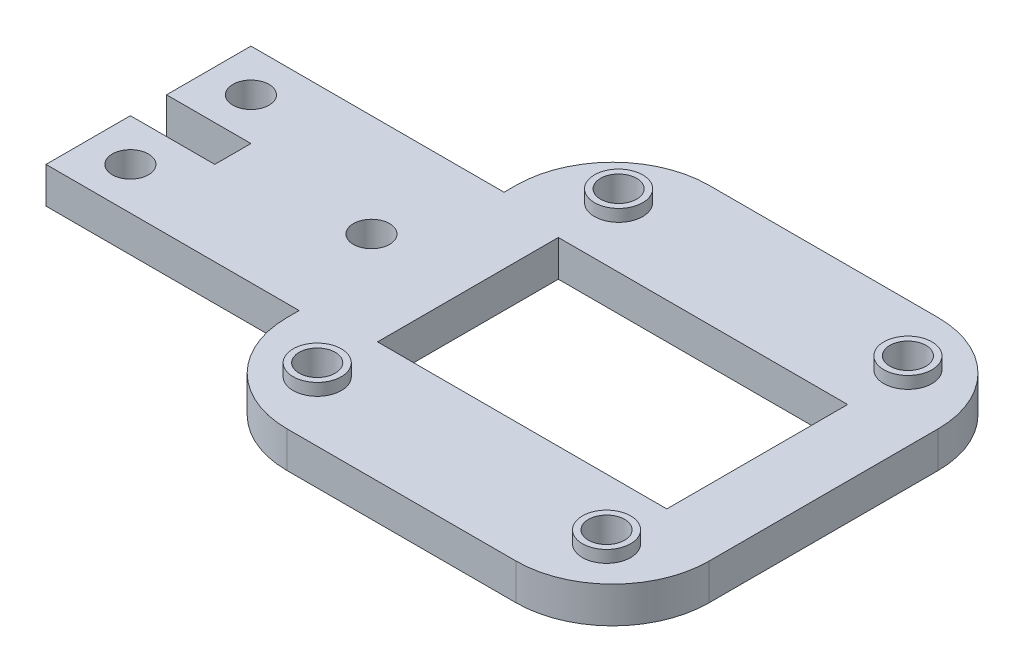
ISO-10303-21;
HEADER;
FILE_DESCRIPTION(('STEP AP214'),'2;1');
FILE_NAME('part.step','',(''),(''),'','','');
FILE_SCHEMA(('AUTOMOTIVE_DESIGN { 1 0 10303 214 1 1 1 1 }'));
ENDSEC;
DATA;
#1=APPLICATION_CONTEXT('core data for automotive mechanical design processes');
#2=APPLICATION_PROTOCOL_DEFINITION('international standard','automotive_design',2000,#1);
#3=PRODUCT_CONTEXT('',#1,'mechanical');
#4=PRODUCT('Part','Part','',(#3));
#5=PRODUCT_RELATED_PRODUCT_CATEGORY('part','',(#4));
#6=PRODUCT_DEFINITION_FORMATION('','',#4);
#7=PRODUCT_DEFINITION_CONTEXT('part definition',#1,'design');
#8=PRODUCT_DEFINITION('design','',#6,#7);
#9=PRODUCT_DEFINITION_SHAPE('','',#8);
#10=(LENGTH_UNIT() NAMED_UNIT(*) SI_UNIT(.MILLI.,.METRE.));
#11=(NAMED_UNIT(*) PLANE_ANGLE_UNIT() SI_UNIT($,.RADIAN.));
#12=(NAMED_UNIT(*) SI_UNIT($,.STERADIAN.) SOLID_ANGLE_UNIT());
#13=UNCERTAINTY_MEASURE_WITH_UNIT(LENGTH_MEASURE(1.E-05),#10,'distance_accuracy_value','');
#14=(GEOMETRIC_REPRESENTATION_CONTEXT(3) GLOBAL_UNCERTAINTY_ASSIGNED_CONTEXT((#13)) GLOBAL_UNIT_ASSIGNED_CONTEXT((#10,
#11,#12)) REPRESENTATION_CONTEXT('',''));
#15=CARTESIAN_POINT('',(0.,0.,0.));
#16=DIRECTION('',(0.,0.,1.));
#17=DIRECTION('',(1.,0.,0.));
#18=AXIS2_PLACEMENT_3D('',#15,#16,#17);
#19=CARTESIAN_POINT('',(-21.,3.,0.));
#20=DIRECTION('',(1.,0.,0.));
#21=DIRECTION('',(0.,0.,-1.));
#22=AXIS2_PLACEMENT_3D('',#19,#20,#21);
#23=PLANE('',#22);
#24=DIRECTION('',(0.,0.,1.));
#25=VECTOR('',#24,1.);
#26=CARTESIAN_POINT('',(-21.,0.,0.));
#27=LINE('',#26,#25);
#28=CARTESIAN_POINT('',(-21.,0.,-8.5));
#29=VERTEX_POINT('',#28);
#30=CARTESIAN_POINT('',(-21.,0.,-1.5));
#31=VERTEX_POINT('',#30);
#32=EDGE_CURVE('E202',#29,#31,#27,.T.);
#33=ORIENTED_EDGE('',*,*,#32,.T.);
#34=DIRECTION('',(0.,1.,0.));
#35=VECTOR('',#34,1.);
#36=CARTESIAN_POINT('',(-21.,-0.00100000000000013,-1.5));
#37=LINE('',#36,#35);
#38=CARTESIAN_POINT('',(-21.,3.,-1.5));
#39=VERTEX_POINT('',#38);
#40=EDGE_CURVE('E186',#31,#39,#37,.T.);
#41=ORIENTED_EDGE('',*,*,#40,.T.);
#42=DIRECTION('',(0.,0.,1.));
#43=VECTOR('',#42,1.);
#44=CARTESIAN_POINT('',(-21.,3.,0.));
#45=LINE('',#44,#43);
#46=CARTESIAN_POINT('',(-21.,3.,-8.5));
#47=VERTEX_POINT('',#46);
#48=EDGE_CURVE('E227',#47,#39,#45,.T.);
#49=ORIENTED_EDGE('',*,*,#48,.F.);
#50=DIRECTION('',(0.,-1.,0.));
#51=VECTOR('',#50,1.);
#52=CARTESIAN_POINT('',(-21.,3.,-8.5));
#53=LINE('',#52,#51);
#54=EDGE_CURVE('E214',#47,#29,#53,.T.);
#55=ORIENTED_EDGE('',*,*,#54,.T.);
#56=EDGE_LOOP('',(#33,#41,#49,#55));
#57=FACE_BOUND('',#56,.T.);
#58=ADVANCED_FACE('F37',(#57),#23,.F.);
#59=CARTESIAN_POINT('',(0.,3.,0.));
#60=DIRECTION('',(0.,1.,0.));
#61=DIRECTION('',(0.,0.,1.));
#62=AXIS2_PLACEMENT_3D('',#59,#60,#61);
#63=PLANE('',#62);
#64=DIRECTION('',(1.,0.,0.));
#65=VECTOR('',#64,1.);
#66=CARTESIAN_POINT('',(0.,3.,-17.5));
#67=LINE('',#66,#65);
#68=CARTESIAN_POINT('',(8.,3.,-17.5));
#69=VERTEX_POINT('',#68);
#70=CARTESIAN_POINT('',(27.,3.,-17.5));
#71=VERTEX_POINT('',#70);
#72=EDGE_CURVE('E320',#69,#71,#67,.T.);
#73=ORIENTED_EDGE('',*,*,#72,.F.);
#74=CARTESIAN_POINT('',(8.,3.,-9.5));
#75=DIRECTION('',(0.,1.,0.));
#76=DIRECTION('',(0.,0.,1.));
#77=AXIS2_PLACEMENT_3D('',#74,#75,#76);
#78=CIRCLE('',#77,8.);
#79=CARTESIAN_POINT('',(0.,3.,-9.5));
#80=VERTEX_POINT('',#79);
#81=EDGE_CURVE('E253',#69,#80,#78,.T.);
#82=ORIENTED_EDGE('',*,*,#81,.T.);
#83=DIRECTION('',(0.,0.,1.));
#84=VECTOR('',#83,1.);
#85=CARTESIAN_POINT('',(0.,3.,0.));
#86=LINE('',#85,#84);
#87=CARTESIAN_POINT('',(0.,3.,-8.5));
#88=VERTEX_POINT('',#87);
#89=EDGE_CURVE('E318',#80,#88,#86,.T.);
#90=ORIENTED_EDGE('',*,*,#89,.T.);
#91=DIRECTION('',(1.,0.,0.));
#92=VECTOR('',#91,1.);
#93=CARTESIAN_POINT('',(0.,3.,-8.5));
#94=LINE('',#93,#92);
#95=EDGE_CURVE('E307',#47,#88,#94,.T.);
#96=ORIENTED_EDGE('',*,*,#95,.F.);
#97=ORIENTED_EDGE('',*,*,#48,.T.);
#98=DIRECTION('',(-1.,0.,0.));
#99=VECTOR('',#98,1.);
#100=CARTESIAN_POINT('',(-14.,3.,-1.5));
#101=LINE('',#100,#99);
#102=CARTESIAN_POINT('',(-14.,3.,-1.5));
#103=VERTEX_POINT('',#102);
#104=EDGE_CURVE('E195',#103,#39,#101,.T.);
#105=ORIENTED_EDGE('',*,*,#104,.F.);
#106=DIRECTION('',(0.,0.,-1.));
#107=VECTOR('',#106,1.);
#108=CARTESIAN_POINT('',(-14.,3.,-1.5));
#109=LINE('',#108,#107);
#110=CARTESIAN_POINT('',(-14.,3.,1.5));
#111=VERTEX_POINT('',#110);
#112=EDGE_CURVE('E601',#111,#103,#109,.T.);
#113=ORIENTED_EDGE('',*,*,#112,.F.);
#114=DIRECTION('',(1.,0.,0.));
#115=VECTOR('',#114,1.);
#116=CARTESIAN_POINT('',(-14.,3.,1.5));
#117=LINE('',#116,#115);
#118=CARTESIAN_POINT('',(-21.,3.,1.49999999999999));
#119=VERTEX_POINT('',#118);
#120=EDGE_CURVE('E604',#119,#111,#117,.T.);
#121=ORIENTED_EDGE('',*,*,#120,.F.);
#122=CARTESIAN_POINT('',(-21.,3.,8.5));
#123=VERTEX_POINT('',#122);
#124=EDGE_CURVE('E194',#119,#123,#45,.T.);
#125=ORIENTED_EDGE('',*,*,#124,.T.);
#126=DIRECTION('',(1.,0.,0.));
#127=VECTOR('',#126,1.);
#128=CARTESIAN_POINT('',(0.,3.,8.5));
#129=LINE('',#128,#127);
#130=CARTESIAN_POINT('',(0.,3.,8.5));
#131=VERTEX_POINT('',#130);
#132=EDGE_CURVE('E276',#123,#131,#129,.T.);
#133=ORIENTED_EDGE('',*,*,#132,.T.);
#134=DIRECTION('',(0.,0.,1.));
#135=VECTOR('',#134,1.);
#136=CARTESIAN_POINT('',(0.,3.,0.));
#137=LINE('',#136,#135);
#138=CARTESIAN_POINT('',(0.,3.,9.5));
#139=VERTEX_POINT('',#138);
#140=EDGE_CURVE('E266',#131,#139,#137,.T.);
#141=ORIENTED_EDGE('',*,*,#140,.T.);
#142=CARTESIAN_POINT('',(8.,3.,9.5));
#143=DIRECTION('',(0.,1.,0.));
#144=DIRECTION('',(0.,0.,1.));
#145=AXIS2_PLACEMENT_3D('',#142,#143,#144);
#146=CIRCLE('',#145,8.);
#147=CARTESIAN_POINT('',(8.,3.,17.5));
#148=VERTEX_POINT('',#147);
#149=EDGE_CURVE('E251',#139,#148,#146,.T.);
#150=ORIENTED_EDGE('',*,*,#149,.T.);
#151=DIRECTION('',(1.,0.,0.));
#152=VECTOR('',#151,1.);
#153=CARTESIAN_POINT('',(0.,3.,17.5));
#154=LINE('',#153,#152);
#155=CARTESIAN_POINT('',(27.,3.,17.5));
#156=VERTEX_POINT('',#155);
#157=EDGE_CURVE('E278',#148,#156,#154,.T.);
#158=ORIENTED_EDGE('',*,*,#157,.T.);
#159=CARTESIAN_POINT('',(27.,3.,9.5));
#160=DIRECTION('',(0.,1.,0.));
#161=DIRECTION('',(0.,0.,1.));
#162=AXIS2_PLACEMENT_3D('',#159,#160,#161);
#163=CIRCLE('',#162,8.);
#164=CARTESIAN_POINT('',(35.,3.,9.5));
#165=VERTEX_POINT('',#164);
#166=EDGE_CURVE('E52',#156,#165,#163,.T.);
#167=ORIENTED_EDGE('',*,*,#166,.T.);
#168=DIRECTION('',(0.,0.,1.));
#169=VECTOR('',#168,1.);
#170=CARTESIAN_POINT('',(35.,3.,0.));
#171=LINE('',#170,#169);
#172=CARTESIAN_POINT('',(35.,3.,-9.5));
#173=VERTEX_POINT('',#172);
#174=EDGE_CURVE('E367',#173,#165,#171,.T.);
#175=ORIENTED_EDGE('',*,*,#174,.F.);
#176=CARTESIAN_POINT('',(27.,3.,-9.5));
#177=DIRECTION('',(0.,1.,0.));
#178=DIRECTION('',(0.,0.,1.));
#179=AXIS2_PLACEMENT_3D('',#176,#177,#178);
#180=CIRCLE('',#179,8.);
#181=EDGE_CURVE('E248',#173,#71,#180,.T.);
#182=ORIENTED_EDGE('',*,*,#181,.T.);
#183=EDGE_LOOP('',(#73,#82,#90,#96,#97,#105,#113,#121,#125,#133,#141,#150,#158,#167,#175,#182));
#184=FACE_BOUND('',#183,.T.);
#185=CARTESIAN_POINT('',(29.5,3.,12.5));
#186=DIRECTION('',(0.,1.,0.));
#187=DIRECTION('',(0.,0.,1.));
#188=AXIS2_PLACEMENT_3D('',#185,#186,#187);
#189=CIRCLE('',#188,2.);
#190=CARTESIAN_POINT('',(29.5,3.,14.5));
#191=VERTEX_POINT('',#190);
#192=EDGE_CURVE('E554',#191,#191,#189,.T.);
#193=ORIENTED_EDGE('',*,*,#192,.F.);
#194=EDGE_LOOP('',(#193));
#195=FACE_BOUND('',#194,.T.);
#196=CARTESIAN_POINT('',(5.5,3.,-12.5));
#197=DIRECTION('',(0.,1.,0.));
#198=DIRECTION('',(0.,0.,1.));
#199=AXIS2_PLACEMENT_3D('',#196,#197,#198);
#200=CIRCLE('',#199,2.);
#201=CARTESIAN_POINT('',(5.5,3.,-10.5));
#202=VERTEX_POINT('',#201);
#203=EDGE_CURVE('E469',#202,#202,#200,.T.);
#204=ORIENTED_EDGE('',*,*,#203,.F.);
#205=EDGE_LOOP('',(#204));
#206=FACE_BOUND('',#205,.T.);
#207=CARTESIAN_POINT('',(-2.5,3.,0.));
#208=DIRECTION('',(0.,1.,0.));
#209=DIRECTION('',(0.,0.,1.));
#210=AXIS2_PLACEMENT_3D('',#207,#208,#209);
#211=CIRCLE('',#210,1.5);
#212=CARTESIAN_POINT('',(-2.5,3.,1.5));
#213=VERTEX_POINT('',#212);
#214=EDGE_CURVE('E206',#213,#213,#211,.T.);
#215=ORIENTED_EDGE('',*,*,#214,.F.);
#216=EDGE_LOOP('',(#215));
#217=FACE_BOUND('',#216,.T.);
#218=CARTESIAN_POINT('',(-17.5,3.,5.));
#219=DIRECTION('',(0.,1.,0.));
#220=DIRECTION('',(0.,0.,1.));
#221=AXIS2_PLACEMENT_3D('',#218,#219,#220);
#222=CIRCLE('',#221,1.5);
#223=CARTESIAN_POINT('',(-17.5,3.,6.5));
#224=VERTEX_POINT('',#223);
#225=EDGE_CURVE('E479',#224,#224,#222,.T.);
#226=ORIENTED_EDGE('',*,*,#225,.F.);
#227=EDGE_LOOP('',(#226));
#228=FACE_BOUND('',#227,.T.);
#229=CARTESIAN_POINT('',(-17.5,3.,-5.));
#230=DIRECTION('',(0.,1.,0.));
#231=DIRECTION('',(0.,0.,1.));
#232=AXIS2_PLACEMENT_3D('',#229,#230,#231);
#233=CIRCLE('',#232,1.5);
#234=CARTESIAN_POINT('',(-17.5,3.,-3.5));
#235=VERTEX_POINT('',#234);
#236=EDGE_CURVE('E482',#235,#235,#233,.T.);
#237=ORIENTED_EDGE('',*,*,#236,.F.);
#238=EDGE_LOOP('',(#237));
#239=FACE_BOUND('',#238,.T.);
#240=DIRECTION('',(1.,0.,0.));
#241=VECTOR('',#240,1.);
#242=CARTESIAN_POINT('',(0.,3.,-7.5));
#243=LINE('',#242,#241);
#244=CARTESIAN_POINT('',(5.5,3.,-7.5));
#245=VERTEX_POINT('',#244);
#246=CARTESIAN_POINT('',(29.5,3.,-7.5));
#247=VERTEX_POINT('',#246);
#248=EDGE_CURVE('E485',#245,#247,#243,.T.);
#249=ORIENTED_EDGE('',*,*,#248,.T.);
#250=DIRECTION('',(0.,0.,1.));
#251=VECTOR('',#250,1.);
#252=CARTESIAN_POINT('',(29.5,3.,0.));
#253=LINE('',#252,#251);
#254=CARTESIAN_POINT('',(29.5,3.,7.5));
#255=VERTEX_POINT('',#254);
#256=EDGE_CURVE('E488',#247,#255,#253,.T.);
#257=ORIENTED_EDGE('',*,*,#256,.T.);
#258=DIRECTION('',(1.,0.,0.));
#259=VECTOR('',#258,1.);
#260=CARTESIAN_POINT('',(0.,3.,7.5));
#261=LINE('',#260,#259);
#262=CARTESIAN_POINT('',(5.5,3.,7.5));
#263=VERTEX_POINT('',#262);
#264=EDGE_CURVE('E362',#263,#255,#261,.T.);
#265=ORIENTED_EDGE('',*,*,#264,.F.);
#266=DIRECTION('',(0.,0.,1.));
#267=VECTOR('',#266,1.);
#268=CARTESIAN_POINT('',(5.5,3.,0.));
#269=LINE('',#268,#267);
#270=EDGE_CURVE('E359',#245,#263,#269,.T.);
#271=ORIENTED_EDGE('',*,*,#270,.F.);
#272=EDGE_LOOP('',(#249,#257,#265,#271));
#273=FACE_BOUND('',#272,.T.);
#274=CARTESIAN_POINT('',(29.5,3.,-12.5));
#275=DIRECTION('',(0.,1.,0.));
#276=DIRECTION('',(0.,0.,1.));
#277=AXIS2_PLACEMENT_3D('',#274,#275,#276);
#278=CIRCLE('',#277,2.);
#279=CARTESIAN_POINT('',(29.5,3.,-10.5));
#280=VERTEX_POINT('',#279);
#281=EDGE_CURVE('E563',#280,#280,#278,.T.);
#282=ORIENTED_EDGE('',*,*,#281,.F.);
#283=EDGE_LOOP('',(#282));
#284=FACE_BOUND('',#283,.T.);
#285=CARTESIAN_POINT('',(5.5,3.,12.5));
#286=DIRECTION('',(0.,1.,0.));
#287=DIRECTION('',(0.,0.,1.));
#288=AXIS2_PLACEMENT_3D('',#285,#286,#287);
#289=CIRCLE('',#288,2.);
#290=CARTESIAN_POINT('',(5.5,3.,14.5));
#291=VERTEX_POINT('',#290);
#292=EDGE_CURVE('E543',#291,#291,#289,.T.);
#293=ORIENTED_EDGE('',*,*,#292,.F.);
#294=EDGE_LOOP('',(#293));
#295=FACE_BOUND('',#294,.T.);
#296=ADVANCED_FACE('F272',(#184,#195,#206,#217,#228,#239,#273,#284,#295),#63,.T.);
#297=CARTESIAN_POINT('',(0.,3.,8.5));
#298=DIRECTION('',(0.,0.,-1.));
#299=DIRECTION('',(-1.,0.,0.));
#300=AXIS2_PLACEMENT_3D('',#297,#298,#299);
#301=PLANE('',#300);
#302=DIRECTION('',(1.,0.,0.));
#303=VECTOR('',#302,1.);
#304=CARTESIAN_POINT('',(0.,0.,8.5));
#305=LINE('',#304,#303);
#306=CARTESIAN_POINT('',(-21.,0.,8.5));
#307=VERTEX_POINT('',#306);
#308=CARTESIAN_POINT('',(0.,0.,8.5));
#309=VERTEX_POINT('',#308);
#310=EDGE_CURVE('E201',#307,#309,#305,.T.);
#311=ORIENTED_EDGE('',*,*,#310,.T.);
#312=DIRECTION('',(0.,-1.,0.));
#313=VECTOR('',#312,1.);
#314=CARTESIAN_POINT('',(0.,3.,8.5));
#315=LINE('',#314,#313);
#316=EDGE_CURVE('E220',#131,#309,#315,.T.);
#317=ORIENTED_EDGE('',*,*,#316,.F.);
#318=ORIENTED_EDGE('',*,*,#132,.F.);
#319=DIRECTION('',(0.,-1.,0.));
#320=VECTOR('',#319,1.);
#321=CARTESIAN_POINT('',(-21.,3.,8.5));
#322=LINE('',#321,#320);
#323=EDGE_CURVE('E212',#123,#307,#322,.T.);
#324=ORIENTED_EDGE('',*,*,#323,.T.);
#325=EDGE_LOOP('',(#311,#317,#318,#324));
#326=FACE_BOUND('',#325,.T.);
#327=ADVANCED_FACE('F358',(#326),#301,.F.);
#328=CARTESIAN_POINT('',(0.,3.,0.));
#329=DIRECTION('',(1.,0.,0.));
#330=DIRECTION('',(0.,0.,-1.));
#331=AXIS2_PLACEMENT_3D('',#328,#329,#330);
#332=PLANE('',#331);
#333=DIRECTION('',(0.,0.,1.));
#334=VECTOR('',#333,1.);
#335=CARTESIAN_POINT('',(0.,0.,0.));
#336=LINE('',#335,#334);
#337=CARTESIAN_POINT('',(0.,0.,9.5));
#338=VERTEX_POINT('',#337);
#339=EDGE_CURVE('E268',#309,#338,#336,.T.);
#340=ORIENTED_EDGE('',*,*,#339,.T.);
#341=DIRECTION('',(0.,-1.,0.));
#342=VECTOR('',#341,1.);
#343=CARTESIAN_POINT('',(0.,3.,9.5));
#344=LINE('',#343,#342);
#345=EDGE_CURVE('E260',#338,#139,#344,.F.);
#346=ORIENTED_EDGE('',*,*,#345,.T.);
#347=ORIENTED_EDGE('',*,*,#140,.F.);
#348=ORIENTED_EDGE('',*,*,#316,.T.);
#349=EDGE_LOOP('',(#340,#346,#347,#348));
#350=FACE_BOUND('',#349,.T.);
#351=ADVANCED_FACE('F265',(#350),#332,.F.);
#352=CARTESIAN_POINT('',(0.,3.,17.5));
#353=DIRECTION('',(0.,0.,-1.));
#354=DIRECTION('',(-1.,0.,0.));
#355=AXIS2_PLACEMENT_3D('',#352,#353,#354);
#356=PLANE('',#355);
#357=ORIENTED_EDGE('',*,*,#157,.F.);
#358=DIRECTION('',(0.,-1.,0.));
#359=VECTOR('',#358,1.);
#360=CARTESIAN_POINT('',(8.,3.,17.5));
#361=LINE('',#360,#359);
#362=CARTESIAN_POINT('',(8.,0.,17.5));
#363=VERTEX_POINT('',#362);
#364=EDGE_CURVE('E257',#148,#363,#361,.T.);
#365=ORIENTED_EDGE('',*,*,#364,.T.);
#366=DIRECTION('',(1.,0.,0.));
#367=VECTOR('',#366,1.);
#368=CARTESIAN_POINT('',(0.,0.,17.5));
#369=LINE('',#368,#367);
#370=CARTESIAN_POINT('',(27.,0.,17.5));
#371=VERTEX_POINT('',#370);
#372=EDGE_CURVE('E286',#363,#371,#369,.T.);
#373=ORIENTED_EDGE('',*,*,#372,.T.);
#374=DIRECTION('',(0.,-1.,0.));
#375=VECTOR('',#374,1.);
#376=CARTESIAN_POINT('',(27.,3.,17.5));
#377=LINE('',#376,#375);
#378=EDGE_CURVE('E255',#371,#156,#377,.F.);
#379=ORIENTED_EDGE('',*,*,#378,.T.);
#380=EDGE_LOOP('',(#357,#365,#373,#379));
#381=FACE_BOUND('',#380,.T.);
#382=ADVANCED_FACE('F285',(#381),#356,.F.);
#383=CARTESIAN_POINT('',(35.,3.,0.));
#384=DIRECTION('',(1.,0.,0.));
#385=DIRECTION('',(0.,0.,-1.));
#386=AXIS2_PLACEMENT_3D('',#383,#384,#385);
#387=PLANE('',#386);
#388=ORIENTED_EDGE('',*,*,#174,.T.);
#389=DIRECTION('',(0.,-1.,0.));
#390=VECTOR('',#389,1.);
#391=CARTESIAN_POINT('',(35.,0.,9.5));
#392=LINE('',#391,#390);
#393=CARTESIAN_POINT('',(35.,0.,9.5));
#394=VERTEX_POINT('',#393);
#395=EDGE_CURVE('E11',#165,#394,#392,.T.);
#396=ORIENTED_EDGE('',*,*,#395,.T.);
#397=DIRECTION('',(0.,0.,1.));
#398=VECTOR('',#397,1.);
#399=CARTESIAN_POINT('',(35.,0.,0.));
#400=LINE('',#399,#398);
#401=CARTESIAN_POINT('',(35.,0.,-9.5));
#402=VERTEX_POINT('',#401);
#403=EDGE_CURVE('E289',#402,#394,#400,.T.);
#404=ORIENTED_EDGE('',*,*,#403,.F.);
#405=DIRECTION('',(0.,-1.,0.));
#406=VECTOR('',#405,1.);
#407=CARTESIAN_POINT('',(35.,3.,-9.5));
#408=LINE('',#407,#406);
#409=EDGE_CURVE('E45',#402,#173,#408,.F.);
#410=ORIENTED_EDGE('',*,*,#409,.T.);
#411=EDGE_LOOP('',(#388,#396,#404,#410));
#412=FACE_BOUND('',#411,.T.);
#413=ADVANCED_FACE('F377',(#412),#387,.T.);
#414=CARTESIAN_POINT('',(0.,3.,-17.5));
#415=DIRECTION('',(0.,0.,-1.));
#416=DIRECTION('',(-1.,0.,0.));
#417=AXIS2_PLACEMENT_3D('',#414,#415,#416);
#418=PLANE('',#417);
#419=DIRECTION('',(1.,0.,0.));
#420=VECTOR('',#419,1.);
#421=CARTESIAN_POINT('',(0.,0.,-17.5));
#422=LINE('',#421,#420);
#423=CARTESIAN_POINT('',(8.,0.,-17.5));
#424=VERTEX_POINT('',#423);
#425=CARTESIAN_POINT('',(27.,0.,-17.5));
#426=VERTEX_POINT('',#425);
#427=EDGE_CURVE('E291',#424,#426,#422,.T.);
#428=ORIENTED_EDGE('',*,*,#427,.F.);
#429=DIRECTION('',(0.,-1.,0.));
#430=VECTOR('',#429,1.);
#431=CARTESIAN_POINT('',(8.,3.,-17.5));
#432=LINE('',#431,#430);
#433=EDGE_CURVE('E246',#424,#69,#432,.F.);
#434=ORIENTED_EDGE('',*,*,#433,.T.);
#435=ORIENTED_EDGE('',*,*,#72,.T.);
#436=DIRECTION('',(0.,-1.,0.));
#437=VECTOR('',#436,1.);
#438=CARTESIAN_POINT('',(27.,3.,-17.5));
#439=LINE('',#438,#437);
#440=EDGE_CURVE('E243',#71,#426,#439,.T.);
#441=ORIENTED_EDGE('',*,*,#440,.T.);
#442=EDGE_LOOP('',(#428,#434,#435,#441));
#443=FACE_BOUND('',#442,.T.);
#444=ADVANCED_FACE('F372',(#443),#418,.T.);
#445=CARTESIAN_POINT('',(0.,3.,0.));
#446=DIRECTION('',(1.,0.,0.));
#447=DIRECTION('',(0.,0.,-1.));
#448=AXIS2_PLACEMENT_3D('',#445,#446,#447);
#449=PLANE('',#448);
#450=ORIENTED_EDGE('',*,*,#89,.F.);
#451=DIRECTION('',(0.,-1.,0.));
#452=VECTOR('',#451,1.);
#453=CARTESIAN_POINT('',(0.,0.,-9.5));
#454=LINE('',#453,#452);
#455=CARTESIAN_POINT('',(0.,0.,-9.5));
#456=VERTEX_POINT('',#455);
#457=EDGE_CURVE('E223',#80,#456,#454,.T.);
#458=ORIENTED_EDGE('',*,*,#457,.T.);
#459=DIRECTION('',(0.,0.,1.));
#460=VECTOR('',#459,1.);
#461=CARTESIAN_POINT('',(0.,0.,0.));
#462=LINE('',#461,#460);
#463=CARTESIAN_POINT('',(0.,0.,-8.5));
#464=VERTEX_POINT('',#463);
#465=EDGE_CURVE('E208',#456,#464,#462,.T.);
#466=ORIENTED_EDGE('',*,*,#465,.T.);
#467=DIRECTION('',(0.,-1.,0.));
#468=VECTOR('',#467,1.);
#469=CARTESIAN_POINT('',(0.,3.,-8.5));
#470=LINE('',#469,#468);
#471=EDGE_CURVE('E217',#88,#464,#470,.T.);
#472=ORIENTED_EDGE('',*,*,#471,.F.);
#473=EDGE_LOOP('',(#450,#458,#466,#472));
#474=FACE_BOUND('',#473,.T.);
#475=ADVANCED_FACE('F300',(#474),#449,.F.);
#476=CARTESIAN_POINT('',(0.,3.,-8.5));
#477=DIRECTION('',(0.,0.,-1.));
#478=DIRECTION('',(-1.,0.,0.));
#479=AXIS2_PLACEMENT_3D('',#476,#477,#478);
#480=PLANE('',#479);
#481=DIRECTION('',(1.,0.,0.));
#482=VECTOR('',#481,1.);
#483=CARTESIAN_POINT('',(0.,0.,-8.5));
#484=LINE('',#483,#482);
#485=EDGE_CURVE('E203',#29,#464,#484,.T.);
#486=ORIENTED_EDGE('',*,*,#485,.F.);
#487=ORIENTED_EDGE('',*,*,#54,.F.);
#488=ORIENTED_EDGE('',*,*,#95,.T.);
#489=ORIENTED_EDGE('',*,*,#471,.T.);
#490=EDGE_LOOP('',(#486,#487,#488,#489));
#491=FACE_BOUND('',#490,.T.);
#492=ADVANCED_FACE('F305',(#491),#480,.T.);
#493=CARTESIAN_POINT('',(0.,3.,-7.5));
#494=DIRECTION('',(0.,0.,-1.));
#495=DIRECTION('',(-1.,0.,0.));
#496=AXIS2_PLACEMENT_3D('',#493,#494,#495);
#497=PLANE('',#496);
#498=DIRECTION('',(1.,0.,0.));
#499=VECTOR('',#498,1.);
#500=CARTESIAN_POINT('',(0.,0.,-7.5));
#501=LINE('',#500,#499);
#502=CARTESIAN_POINT('',(5.5,0.,-7.5));
#503=VERTEX_POINT('',#502);
#504=CARTESIAN_POINT('',(29.5,0.,-7.5));
#505=VERTEX_POINT('',#504);
#506=EDGE_CURVE('E346',#503,#505,#501,.T.);
#507=ORIENTED_EDGE('',*,*,#506,.T.);
#508=DIRECTION('',(0.,-1.,0.));
#509=VECTOR('',#508,1.);
#510=CARTESIAN_POINT('',(29.5,3.,-7.5));
#511=LINE('',#510,#509);
#512=EDGE_CURVE('E215',#247,#505,#511,.T.);
#513=ORIENTED_EDGE('',*,*,#512,.F.);
#514=ORIENTED_EDGE('',*,*,#248,.F.);
#515=DIRECTION('',(0.,-1.,0.));
#516=VECTOR('',#515,1.);
#517=CARTESIAN_POINT('',(5.5,3.,-7.5));
#518=LINE('',#517,#516);
#519=EDGE_CURVE('E224',#245,#503,#518,.T.);
#520=ORIENTED_EDGE('',*,*,#519,.T.);
#521=EDGE_LOOP('',(#507,#513,#514,#520));
#522=FACE_BOUND('',#521,.T.);
#523=ADVANCED_FACE('F505',(#522),#497,.F.);
#524=CARTESIAN_POINT('',(29.5,3.,0.));
#525=DIRECTION('',(1.,0.,0.));
#526=DIRECTION('',(0.,0.,-1.));
#527=AXIS2_PLACEMENT_3D('',#524,#525,#526);
#528=PLANE('',#527);
#529=DIRECTION('',(0.,0.,1.));
#530=VECTOR('',#529,1.);
#531=CARTESIAN_POINT('',(29.5,0.,0.));
#532=LINE('',#531,#530);
#533=CARTESIAN_POINT('',(29.5,0.,7.5));
#534=VERTEX_POINT('',#533);
#535=EDGE_CURVE('E349',#505,#534,#532,.T.);
#536=ORIENTED_EDGE('',*,*,#535,.T.);
#537=DIRECTION('',(0.,-1.,0.));
#538=VECTOR('',#537,1.);
#539=CARTESIAN_POINT('',(29.5,3.,7.5));
#540=LINE('',#539,#538);
#541=EDGE_CURVE('E229',#255,#534,#540,.T.);
#542=ORIENTED_EDGE('',*,*,#541,.F.);
#543=ORIENTED_EDGE('',*,*,#256,.F.);
#544=ORIENTED_EDGE('',*,*,#512,.T.);
#545=EDGE_LOOP('',(#536,#542,#543,#544));
#546=FACE_BOUND('',#545,.T.);
#547=ADVANCED_FACE('F507',(#546),#528,.F.);
#548=CARTESIAN_POINT('',(0.,3.,7.5));
#549=DIRECTION('',(0.,0.,-1.));
#550=DIRECTION('',(-1.,0.,0.));
#551=AXIS2_PLACEMENT_3D('',#548,#549,#550);
#552=PLANE('',#551);
#553=DIRECTION('',(1.,0.,0.));
#554=VECTOR('',#553,1.);
#555=CARTESIAN_POINT('',(0.,0.,7.5));
#556=LINE('',#555,#554);
#557=CARTESIAN_POINT('',(5.5,0.,7.5));
#558=VERTEX_POINT('',#557);
#559=EDGE_CURVE('E352',#558,#534,#556,.T.);
#560=ORIENTED_EDGE('',*,*,#559,.F.);
#561=DIRECTION('',(0.,-1.,0.));
#562=VECTOR('',#561,1.);
#563=CARTESIAN_POINT('',(5.5,3.,7.5));
#564=LINE('',#563,#562);
#565=EDGE_CURVE('E226',#263,#558,#564,.T.);
#566=ORIENTED_EDGE('',*,*,#565,.F.);
#567=ORIENTED_EDGE('',*,*,#264,.T.);
#568=ORIENTED_EDGE('',*,*,#541,.T.);
#569=EDGE_LOOP('',(#560,#566,#567,#568));
#570=FACE_BOUND('',#569,.T.);
#571=ADVANCED_FACE('F493',(#570),#552,.T.);
#572=CARTESIAN_POINT('',(5.5,3.,0.));
#573=DIRECTION('',(1.,0.,0.));
#574=DIRECTION('',(0.,0.,-1.));
#575=AXIS2_PLACEMENT_3D('',#572,#573,#574);
#576=PLANE('',#575);
#577=DIRECTION('',(0.,0.,1.));
#578=VECTOR('',#577,1.);
#579=CARTESIAN_POINT('',(5.5,0.,0.));
#580=LINE('',#579,#578);
#581=EDGE_CURVE('E355',#503,#558,#580,.T.);
#582=ORIENTED_EDGE('',*,*,#581,.F.);
#583=ORIENTED_EDGE('',*,*,#519,.F.);
#584=ORIENTED_EDGE('',*,*,#270,.T.);
#585=ORIENTED_EDGE('',*,*,#565,.T.);
#586=EDGE_LOOP('',(#582,#583,#584,#585));
#587=FACE_BOUND('',#586,.T.);
#588=ADVANCED_FACE('F500',(#587),#576,.T.);
#589=CARTESIAN_POINT('',(-17.5,3.,-5.));
#590=DIRECTION('',(0.,-1.,0.));
#591=DIRECTION('',(0.,0.,-1.));
#592=AXIS2_PLACEMENT_3D('',#589,#590,#591);
#593=CYLINDRICAL_SURFACE('',#592,1.5);
#594=ORIENTED_EDGE('',*,*,#236,.T.);
#595=EDGE_LOOP('',(#594));
#596=FACE_BOUND('',#595,.T.);
#597=CARTESIAN_POINT('',(-17.5,0.,-5.));
#598=DIRECTION('',(0.,1.,0.));
#599=DIRECTION('',(0.,0.,1.));
#600=AXIS2_PLACEMENT_3D('',#597,#598,#599);
#601=CIRCLE('',#600,1.5);
#602=CARTESIAN_POINT('',(-17.5,0.,-3.5));
#603=VERTEX_POINT('',#602);
#604=EDGE_CURVE('E343',#603,#603,#601,.T.);
#605=ORIENTED_EDGE('',*,*,#604,.F.);
#606=EDGE_LOOP('',(#605));
#607=FACE_BOUND('',#606,.T.);
#608=ADVANCED_FACE('F519',(#596,#607),#593,.F.);
#609=CARTESIAN_POINT('',(-17.5,3.,5.));
#610=DIRECTION('',(0.,-1.,0.));
#611=DIRECTION('',(0.,0.,-1.));
#612=AXIS2_PLACEMENT_3D('',#609,#610,#611);
#613=CYLINDRICAL_SURFACE('',#612,1.5);
#614=ORIENTED_EDGE('',*,*,#225,.T.);
#615=EDGE_LOOP('',(#614));
#616=FACE_BOUND('',#615,.T.);
#617=CARTESIAN_POINT('',(-17.5,0.,5.));
#618=DIRECTION('',(0.,1.,0.));
#619=DIRECTION('',(0.,0.,1.));
#620=AXIS2_PLACEMENT_3D('',#617,#618,#619);
#621=CIRCLE('',#620,1.5);
#622=CARTESIAN_POINT('',(-17.5,0.,6.5));
#623=VERTEX_POINT('',#622);
#624=EDGE_CURVE('E340',#623,#623,#621,.T.);
#625=ORIENTED_EDGE('',*,*,#624,.F.);
#626=EDGE_LOOP('',(#625));
#627=FACE_BOUND('',#626,.T.);
#628=ADVANCED_FACE('F522',(#616,#627),#613,.F.);
#629=CARTESIAN_POINT('',(5.5,3.,-12.5));
#630=DIRECTION('',(0.,-1.,0.));
#631=DIRECTION('',(0.,0.,-1.));
#632=AXIS2_PLACEMENT_3D('',#629,#630,#631);
#633=CYLINDRICAL_SURFACE('',#632,1.5);
#634=CARTESIAN_POINT('',(5.5,0.,-12.5));
#635=DIRECTION('',(0.,1.,0.));
#636=DIRECTION('',(0.,0.,1.));
#637=AXIS2_PLACEMENT_3D('',#634,#635,#636);
#638=CIRCLE('',#637,1.5);
#639=CARTESIAN_POINT('',(5.5,0.,-11.));
#640=VERTEX_POINT('',#639);
#641=EDGE_CURVE('E337',#640,#640,#638,.T.);
#642=ORIENTED_EDGE('',*,*,#641,.F.);
#643=EDGE_LOOP('',(#642));
#644=FACE_BOUND('',#643,.T.);
#645=CARTESIAN_POINT('',(5.5,4.,-12.5));
#646=DIRECTION('',(0.,1.,0.));
#647=DIRECTION('',(0.,0.,1.));
#648=AXIS2_PLACEMENT_3D('',#645,#646,#647);
#649=CIRCLE('',#648,1.5);
#650=CARTESIAN_POINT('',(5.5,4.,-11.));
#651=VERTEX_POINT('',#650);
#652=EDGE_CURVE('E471',#651,#651,#649,.T.);
#653=ORIENTED_EDGE('',*,*,#652,.T.);
#654=EDGE_LOOP('',(#653));
#655=FACE_BOUND('',#654,.T.);
#656=ADVANCED_FACE('F526',(#644,#655),#633,.F.);
#657=CARTESIAN_POINT('',(29.5,3.,-12.5));
#658=DIRECTION('',(0.,-1.,0.));
#659=DIRECTION('',(0.,0.,-1.));
#660=AXIS2_PLACEMENT_3D('',#657,#658,#659);
#661=CYLINDRICAL_SURFACE('',#660,1.5);
#662=CARTESIAN_POINT('',(29.5,0.,-12.5));
#663=DIRECTION('',(0.,1.,0.));
#664=DIRECTION('',(0.,0.,1.));
#665=AXIS2_PLACEMENT_3D('',#662,#663,#664);
#666=CIRCLE('',#665,1.5);
#667=CARTESIAN_POINT('',(29.5,0.,-11.));
#668=VERTEX_POINT('',#667);
#669=EDGE_CURVE('E334',#668,#668,#666,.T.);
#670=ORIENTED_EDGE('',*,*,#669,.F.);
#671=EDGE_LOOP('',(#670));
#672=FACE_BOUND('',#671,.T.);
#673=CARTESIAN_POINT('',(29.5,4.,-12.5));
#674=DIRECTION('',(0.,1.,0.));
#675=DIRECTION('',(0.,0.,1.));
#676=AXIS2_PLACEMENT_3D('',#673,#674,#675);
#677=CIRCLE('',#676,1.5);
#678=CARTESIAN_POINT('',(29.5,4.,-11.));
#679=VERTEX_POINT('',#678);
#680=EDGE_CURVE('E558',#679,#679,#677,.T.);
#681=ORIENTED_EDGE('',*,*,#680,.T.);
#682=EDGE_LOOP('',(#681));
#683=FACE_BOUND('',#682,.T.);
#684=ADVANCED_FACE('F530',(#672,#683),#661,.F.);
#685=CARTESIAN_POINT('',(5.5,3.,12.5));
#686=DIRECTION('',(0.,-1.,0.));
#687=DIRECTION('',(0.,0.,-1.));
#688=AXIS2_PLACEMENT_3D('',#685,#686,#687);
#689=CYLINDRICAL_SURFACE('',#688,1.5);
#690=CARTESIAN_POINT('',(5.5,0.,12.5));
#691=DIRECTION('',(0.,1.,0.));
#692=DIRECTION('',(0.,0.,1.));
#693=AXIS2_PLACEMENT_3D('',#690,#691,#692);
#694=CIRCLE('',#693,1.5);
#695=CARTESIAN_POINT('',(5.5,0.,14.));
#696=VERTEX_POINT('',#695);
#697=EDGE_CURVE('E331',#696,#696,#694,.T.);
#698=ORIENTED_EDGE('',*,*,#697,.F.);
#699=EDGE_LOOP('',(#698));
#700=FACE_BOUND('',#699,.T.);
#701=CARTESIAN_POINT('',(5.5,4.,12.5));
#702=DIRECTION('',(0.,1.,0.));
#703=DIRECTION('',(0.,0.,1.));
#704=AXIS2_PLACEMENT_3D('',#701,#702,#703);
#705=CIRCLE('',#704,1.5);
#706=CARTESIAN_POINT('',(5.5,4.,14.));
#707=VERTEX_POINT('',#706);
#708=EDGE_CURVE('E185',#707,#707,#705,.T.);
#709=ORIENTED_EDGE('',*,*,#708,.T.);
#710=EDGE_LOOP('',(#709));
#711=FACE_BOUND('',#710,.T.);
#712=ADVANCED_FACE('F410',(#700,#711),#689,.F.);
#713=CARTESIAN_POINT('',(29.5,3.,12.5));
#714=DIRECTION('',(0.,-1.,0.));
#715=DIRECTION('',(0.,0.,-1.));
#716=AXIS2_PLACEMENT_3D('',#713,#714,#715);
#717=CYLINDRICAL_SURFACE('',#716,1.5);
#718=CARTESIAN_POINT('',(29.5,0.,12.5));
#719=DIRECTION('',(0.,1.,0.));
#720=DIRECTION('',(0.,0.,1.));
#721=AXIS2_PLACEMENT_3D('',#718,#719,#720);
#722=CIRCLE('',#721,1.5);
#723=CARTESIAN_POINT('',(29.5,0.,14.));
#724=VERTEX_POINT('',#723);
#725=EDGE_CURVE('E327',#724,#724,#722,.T.);
#726=ORIENTED_EDGE('',*,*,#725,.F.);
#727=EDGE_LOOP('',(#726));
#728=FACE_BOUND('',#727,.T.);
#729=CARTESIAN_POINT('',(29.5,4.,12.5));
#730=DIRECTION('',(0.,1.,0.));
#731=DIRECTION('',(0.,0.,1.));
#732=AXIS2_PLACEMENT_3D('',#729,#730,#731);
#733=CIRCLE('',#732,1.5);
#734=CARTESIAN_POINT('',(29.5,4.,14.));
#735=VERTEX_POINT('',#734);
#736=EDGE_CURVE('E550',#735,#735,#733,.T.);
#737=ORIENTED_EDGE('',*,*,#736,.T.);
#738=EDGE_LOOP('',(#737));
#739=FACE_BOUND('',#738,.T.);
#740=ADVANCED_FACE('F404',(#728,#739),#717,.F.);
#741=CARTESIAN_POINT('',(-2.5,3.,0.));
#742=DIRECTION('',(0.,-1.,0.));
#743=DIRECTION('',(0.,0.,-1.));
#744=AXIS2_PLACEMENT_3D('',#741,#742,#743);
#745=CYLINDRICAL_SURFACE('',#744,1.5);
#746=ORIENTED_EDGE('',*,*,#214,.T.);
#747=EDGE_LOOP('',(#746));
#748=FACE_BOUND('',#747,.T.);
#749=CARTESIAN_POINT('',(-2.5,0.,0.));
#750=DIRECTION('',(0.,1.,0.));
#751=DIRECTION('',(0.,0.,1.));
#752=AXIS2_PLACEMENT_3D('',#749,#750,#751);
#753=CIRCLE('',#752,1.5);
#754=CARTESIAN_POINT('',(-2.5,0.,1.5));
#755=VERTEX_POINT('',#754);
#756=EDGE_CURVE('E324',#755,#755,#753,.T.);
#757=ORIENTED_EDGE('',*,*,#756,.F.);
#758=EDGE_LOOP('',(#757));
#759=FACE_BOUND('',#758,.T.);
#760=ADVANCED_FACE('F397',(#748,#759),#745,.F.);
#761=ORIENTED_EDGE('',*,*,#124,.F.);
#762=DIRECTION('',(0.,1.,0.));
#763=VECTOR('',#762,1.);
#764=CARTESIAN_POINT('',(-21.,-0.00100000000000013,1.49999999999999));
#765=LINE('',#764,#763);
#766=CARTESIAN_POINT('',(-21.,0.,1.5));
#767=VERTEX_POINT('',#766);
#768=EDGE_CURVE('E179',#767,#119,#765,.T.);
#769=ORIENTED_EDGE('',*,*,#768,.F.);
#770=EDGE_CURVE('E192',#767,#307,#27,.T.);
#771=ORIENTED_EDGE('',*,*,#770,.T.);
#772=ORIENTED_EDGE('',*,*,#323,.F.);
#773=EDGE_LOOP('',(#761,#769,#771,#772));
#774=FACE_BOUND('',#773,.T.);
#775=ADVANCED_FACE('F190',(#774),#23,.F.);
#776=CARTESIAN_POINT('',(0.,0.,0.));
#777=DIRECTION('',(0.,1.,0.));
#778=DIRECTION('',(0.,0.,1.));
#779=AXIS2_PLACEMENT_3D('',#776,#777,#778);
#780=PLANE('',#779);
#781=ORIENTED_EDGE('',*,*,#756,.T.);
#782=EDGE_LOOP('',(#781));
#783=FACE_BOUND('',#782,.T.);
#784=ORIENTED_EDGE('',*,*,#725,.T.);
#785=EDGE_LOOP('',(#784));
#786=FACE_BOUND('',#785,.T.);
#787=ORIENTED_EDGE('',*,*,#697,.T.);
#788=EDGE_LOOP('',(#787));
#789=FACE_BOUND('',#788,.T.);
#790=ORIENTED_EDGE('',*,*,#669,.T.);
#791=EDGE_LOOP('',(#790));
#792=FACE_BOUND('',#791,.T.);
#793=ORIENTED_EDGE('',*,*,#641,.T.);
#794=EDGE_LOOP('',(#793));
#795=FACE_BOUND('',#794,.T.);
#796=ORIENTED_EDGE('',*,*,#624,.T.);
#797=EDGE_LOOP('',(#796));
#798=FACE_BOUND('',#797,.T.);
#799=ORIENTED_EDGE('',*,*,#604,.T.);
#800=EDGE_LOOP('',(#799));
#801=FACE_BOUND('',#800,.T.);
#802=ORIENTED_EDGE('',*,*,#506,.F.);
#803=ORIENTED_EDGE('',*,*,#581,.T.);
#804=ORIENTED_EDGE('',*,*,#559,.T.);
#805=ORIENTED_EDGE('',*,*,#535,.F.);
#806=EDGE_LOOP('',(#802,#803,#804,#805));
#807=FACE_BOUND('',#806,.T.);
#808=ORIENTED_EDGE('',*,*,#465,.F.);
#809=CARTESIAN_POINT('',(8.,0.,-9.5));
#810=DIRECTION('',(0.,1.,0.));
#811=DIRECTION('',(0.,0.,1.));
#812=AXIS2_PLACEMENT_3D('',#809,#810,#811);
#813=CIRCLE('',#812,8.);
#814=EDGE_CURVE('E241',#456,#424,#813,.F.);
#815=ORIENTED_EDGE('',*,*,#814,.T.);
#816=ORIENTED_EDGE('',*,*,#427,.T.);
#817=CARTESIAN_POINT('',(27.,0.,-9.5));
#818=DIRECTION('',(0.,1.,0.));
#819=DIRECTION('',(0.,0.,1.));
#820=AXIS2_PLACEMENT_3D('',#817,#818,#819);
#821=CIRCLE('',#820,8.);
#822=EDGE_CURVE('E235',#426,#402,#821,.F.);
#823=ORIENTED_EDGE('',*,*,#822,.T.);
#824=ORIENTED_EDGE('',*,*,#403,.T.);
#825=CARTESIAN_POINT('',(27.,0.,9.5));
#826=DIRECTION('',(0.,1.,0.));
#827=DIRECTION('',(0.,0.,1.));
#828=AXIS2_PLACEMENT_3D('',#825,#826,#827);
#829=CIRCLE('',#828,8.);
#830=EDGE_CURVE('E237',#394,#371,#829,.F.);
#831=ORIENTED_EDGE('',*,*,#830,.T.);
#832=ORIENTED_EDGE('',*,*,#372,.F.);
#833=CARTESIAN_POINT('',(8.,0.,9.5));
#834=DIRECTION('',(0.,1.,0.));
#835=DIRECTION('',(0.,0.,1.));
#836=AXIS2_PLACEMENT_3D('',#833,#834,#835);
#837=CIRCLE('',#836,8.);
#838=EDGE_CURVE('E239',#363,#338,#837,.F.);
#839=ORIENTED_EDGE('',*,*,#838,.T.);
#840=ORIENTED_EDGE('',*,*,#339,.F.);
#841=ORIENTED_EDGE('',*,*,#310,.F.);
#842=ORIENTED_EDGE('',*,*,#770,.F.);
#843=DIRECTION('',(-1.,0.,0.));
#844=VECTOR('',#843,1.);
#845=CARTESIAN_POINT('',(-14.,0.,1.5));
#846=LINE('',#845,#844);
#847=CARTESIAN_POINT('',(-14.,0.,1.5));
#848=VERTEX_POINT('',#847);
#849=EDGE_CURVE('E175',#848,#767,#846,.T.);
#850=ORIENTED_EDGE('',*,*,#849,.F.);
#851=DIRECTION('',(0.,0.,1.));
#852=VECTOR('',#851,1.);
#853=CARTESIAN_POINT('',(-14.,0.,-1.5));
#854=LINE('',#853,#852);
#855=CARTESIAN_POINT('',(-14.,0.,-1.5));
#856=VERTEX_POINT('',#855);
#857=EDGE_CURVE('E607',#856,#848,#854,.T.);
#858=ORIENTED_EDGE('',*,*,#857,.F.);
#859=DIRECTION('',(1.,0.,0.));
#860=VECTOR('',#859,1.);
#861=CARTESIAN_POINT('',(-14.,0.,-1.5));
#862=LINE('',#861,#860);
#863=EDGE_CURVE('E311',#31,#856,#862,.T.);
#864=ORIENTED_EDGE('',*,*,#863,.F.);
#865=ORIENTED_EDGE('',*,*,#32,.F.);
#866=ORIENTED_EDGE('',*,*,#485,.T.);
#867=EDGE_LOOP('',(#808,#815,#816,#823,#824,#831,#832,#839,#840,#841,#842,#850,#858,#864,#865,#866));
#868=FACE_BOUND('',#867,.T.);
#869=ADVANCED_FACE('F199',(#783,#786,#789,#792,#795,#798,#801,#807,#868),#780,.F.);
#870=CARTESIAN_POINT('',(5.5,4.,-12.5));
#871=DIRECTION('',(0.,1.,0.));
#872=DIRECTION('',(0.,0.,1.));
#873=AXIS2_PLACEMENT_3D('',#870,#871,#872);
#874=PLANE('',#873);
#875=CARTESIAN_POINT('',(5.5,4.,-12.5));
#876=DIRECTION('',(0.,1.,0.));
#877=DIRECTION('',(0.,0.,1.));
#878=AXIS2_PLACEMENT_3D('',#875,#876,#877);
#879=CIRCLE('',#878,2.);
#880=CARTESIAN_POINT('',(5.5,4.,-10.5));
#881=VERTEX_POINT('',#880);
#882=EDGE_CURVE('E328',#881,#881,#879,.T.);
#883=ORIENTED_EDGE('',*,*,#882,.T.);
#884=EDGE_LOOP('',(#883));
#885=FACE_BOUND('',#884,.T.);
#886=ORIENTED_EDGE('',*,*,#652,.F.);
#887=EDGE_LOOP('',(#886));
#888=FACE_BOUND('',#887,.T.);
#889=ADVANCED_FACE('F402',(#885,#888),#874,.T.);
#890=CARTESIAN_POINT('',(5.5,4.,-12.5));
#891=DIRECTION('',(0.,-1.,0.));
#892=DIRECTION('',(0.,0.,-1.));
#893=AXIS2_PLACEMENT_3D('',#890,#891,#892);
#894=CYLINDRICAL_SURFACE('',#893,2.);
#895=ORIENTED_EDGE('',*,*,#882,.F.);
#896=EDGE_LOOP('',(#895));
#897=FACE_BOUND('',#896,.T.);
#898=ORIENTED_EDGE('',*,*,#203,.T.);
#899=EDGE_LOOP('',(#898));
#900=FACE_BOUND('',#899,.T.);
#901=ADVANCED_FACE('F452',(#897,#900),#894,.T.);
#902=CARTESIAN_POINT('',(29.5,4.,-12.5));
#903=DIRECTION('',(0.,1.,0.));
#904=DIRECTION('',(0.,0.,1.));
#905=AXIS2_PLACEMENT_3D('',#902,#903,#904);
#906=PLANE('',#905);
#907=CARTESIAN_POINT('',(29.5,4.,-12.5));
#908=DIRECTION('',(0.,1.,0.));
#909=DIRECTION('',(0.,0.,1.));
#910=AXIS2_PLACEMENT_3D('',#907,#908,#909);
#911=CIRCLE('',#910,2.);
#912=CARTESIAN_POINT('',(29.5,4.,-10.5));
#913=VERTEX_POINT('',#912);
#914=EDGE_CURVE('E475',#913,#913,#911,.T.);
#915=ORIENTED_EDGE('',*,*,#914,.T.);
#916=EDGE_LOOP('',(#915));
#917=FACE_BOUND('',#916,.T.);
#918=ORIENTED_EDGE('',*,*,#680,.F.);
#919=EDGE_LOOP('',(#918));
#920=FACE_BOUND('',#919,.T.);
#921=ADVANCED_FACE('F449',(#917,#920),#906,.T.);
#922=CARTESIAN_POINT('',(29.5,4.,-12.5));
#923=DIRECTION('',(0.,-1.,0.));
#924=DIRECTION('',(0.,0.,-1.));
#925=AXIS2_PLACEMENT_3D('',#922,#923,#924);
#926=CYLINDRICAL_SURFACE('',#925,2.);
#927=ORIENTED_EDGE('',*,*,#914,.F.);
#928=EDGE_LOOP('',(#927));
#929=FACE_BOUND('',#928,.T.);
#930=ORIENTED_EDGE('',*,*,#281,.T.);
#931=EDGE_LOOP('',(#930));
#932=FACE_BOUND('',#931,.T.);
#933=ADVANCED_FACE('F444',(#929,#932),#926,.T.);
#934=CARTESIAN_POINT('',(29.5,4.,12.5));
#935=DIRECTION('',(0.,1.,0.));
#936=DIRECTION('',(0.,0.,1.));
#937=AXIS2_PLACEMENT_3D('',#934,#935,#936);
#938=PLANE('',#937);
#939=CARTESIAN_POINT('',(29.5,4.,12.5));
#940=DIRECTION('',(0.,1.,0.));
#941=DIRECTION('',(0.,0.,1.));
#942=AXIS2_PLACEMENT_3D('',#939,#940,#941);
#943=CIRCLE('',#942,2.);
#944=CARTESIAN_POINT('',(29.5,4.,14.5));
#945=VERTEX_POINT('',#944);
#946=EDGE_CURVE('E555',#945,#945,#943,.T.);
#947=ORIENTED_EDGE('',*,*,#946,.T.);
#948=EDGE_LOOP('',(#947));
#949=FACE_BOUND('',#948,.T.);
#950=ORIENTED_EDGE('',*,*,#736,.F.);
#951=EDGE_LOOP('',(#950));
#952=FACE_BOUND('',#951,.T.);
#953=ADVANCED_FACE('F441',(#949,#952),#938,.T.);
#954=CARTESIAN_POINT('',(29.5,4.,12.5));
#955=DIRECTION('',(0.,-1.,0.));
#956=DIRECTION('',(0.,0.,-1.));
#957=AXIS2_PLACEMENT_3D('',#954,#955,#956);
#958=CYLINDRICAL_SURFACE('',#957,2.);
#959=ORIENTED_EDGE('',*,*,#946,.F.);
#960=EDGE_LOOP('',(#959));
#961=FACE_BOUND('',#960,.T.);
#962=ORIENTED_EDGE('',*,*,#192,.T.);
#963=EDGE_LOOP('',(#962));
#964=FACE_BOUND('',#963,.T.);
#965=ADVANCED_FACE('F436',(#961,#964),#958,.T.);
#966=CARTESIAN_POINT('',(5.5,4.,12.5));
#967=DIRECTION('',(0.,1.,0.));
#968=DIRECTION('',(0.,0.,1.));
#969=AXIS2_PLACEMENT_3D('',#966,#967,#968);
#970=PLANE('',#969);
#971=CARTESIAN_POINT('',(5.5,4.,12.5));
#972=DIRECTION('',(0.,1.,0.));
#973=DIRECTION('',(0.,0.,1.));
#974=AXIS2_PLACEMENT_3D('',#971,#972,#973);
#975=CIRCLE('',#974,2.);
#976=CARTESIAN_POINT('',(5.5,4.,14.5));
#977=VERTEX_POINT('',#976);
#978=EDGE_CURVE('E546',#977,#977,#975,.T.);
#979=ORIENTED_EDGE('',*,*,#978,.T.);
#980=EDGE_LOOP('',(#979));
#981=FACE_BOUND('',#980,.T.);
#982=ORIENTED_EDGE('',*,*,#708,.F.);
#983=EDGE_LOOP('',(#982));
#984=FACE_BOUND('',#983,.T.);
#985=ADVANCED_FACE('F432',(#981,#984),#970,.T.);
#986=CARTESIAN_POINT('',(5.5,4.,12.5));
#987=DIRECTION('',(0.,-1.,0.));
#988=DIRECTION('',(0.,0.,-1.));
#989=AXIS2_PLACEMENT_3D('',#986,#987,#988);
#990=CYLINDRICAL_SURFACE('',#989,2.);
#991=ORIENTED_EDGE('',*,*,#978,.F.);
#992=EDGE_LOOP('',(#991));
#993=FACE_BOUND('',#992,.T.);
#994=ORIENTED_EDGE('',*,*,#292,.T.);
#995=EDGE_LOOP('',(#994));
#996=FACE_BOUND('',#995,.T.);
#997=ADVANCED_FACE('F435',(#993,#996),#990,.T.);
#998=CARTESIAN_POINT('',(-14.,-0.00100000000000013,-1.5));
#999=DIRECTION('',(0.,0.,-1.));
#1000=DIRECTION('',(-1.,0.,0.));
#1001=AXIS2_PLACEMENT_3D('',#998,#999,#1000);
#1002=PLANE('',#1001);
#1003=ORIENTED_EDGE('',*,*,#863,.T.);
#1004=DIRECTION('',(0.,1.,0.));
#1005=VECTOR('',#1004,1.);
#1006=CARTESIAN_POINT('',(-14.,-0.00100000000000013,-1.5));
#1007=LINE('',#1006,#1005);
#1008=EDGE_CURVE('E597',#856,#103,#1007,.T.);
#1009=ORIENTED_EDGE('',*,*,#1008,.T.);
#1010=ORIENTED_EDGE('',*,*,#104,.T.);
#1011=ORIENTED_EDGE('',*,*,#40,.F.);
#1012=EDGE_LOOP('',(#1003,#1009,#1010,#1011));
#1013=FACE_BOUND('',#1012,.T.);
#1014=ADVANCED_FACE('F427',(#1013),#1002,.F.);
#1015=CARTESIAN_POINT('',(-14.,-0.00100000000000013,-1.5));
#1016=DIRECTION('',(1.,0.,0.));
#1017=DIRECTION('',(0.,0.,-1.));
#1018=AXIS2_PLACEMENT_3D('',#1015,#1016,#1017);
#1019=PLANE('',#1018);
#1020=ORIENTED_EDGE('',*,*,#857,.T.);
#1021=DIRECTION('',(0.,1.,0.));
#1022=VECTOR('',#1021,1.);
#1023=CARTESIAN_POINT('',(-14.,-0.00100000000000013,1.5));
#1024=LINE('',#1023,#1022);
#1025=EDGE_CURVE('E181',#848,#111,#1024,.T.);
#1026=ORIENTED_EDGE('',*,*,#1025,.T.);
#1027=ORIENTED_EDGE('',*,*,#112,.T.);
#1028=ORIENTED_EDGE('',*,*,#1008,.F.);
#1029=EDGE_LOOP('',(#1020,#1026,#1027,#1028));
#1030=FACE_BOUND('',#1029,.T.);
#1031=ADVANCED_FACE('F422',(#1030),#1019,.F.);
#1032=CARTESIAN_POINT('',(-14.,-0.00100000000000013,1.5));
#1033=DIRECTION('',(0.,0.,1.));
#1034=DIRECTION('',(1.,0.,0.));
#1035=AXIS2_PLACEMENT_3D('',#1032,#1033,#1034);
#1036=PLANE('',#1035);
#1037=ORIENTED_EDGE('',*,*,#849,.T.);
#1038=ORIENTED_EDGE('',*,*,#768,.T.);
#1039=ORIENTED_EDGE('',*,*,#120,.T.);
#1040=ORIENTED_EDGE('',*,*,#1025,.F.);
#1041=EDGE_LOOP('',(#1037,#1038,#1039,#1040));
#1042=FACE_BOUND('',#1041,.T.);
#1043=ADVANCED_FACE('F177',(#1042),#1036,.F.);
#1044=CARTESIAN_POINT('',(8.,3.,-9.5));
#1045=DIRECTION('',(0.,1.,0.));
#1046=DIRECTION('',(0.,0.,1.));
#1047=AXIS2_PLACEMENT_3D('',#1044,#1045,#1046);
#1048=CYLINDRICAL_SURFACE('',#1047,8.);
#1049=ORIENTED_EDGE('',*,*,#81,.F.);
#1050=ORIENTED_EDGE('',*,*,#433,.F.);
#1051=ORIENTED_EDGE('',*,*,#814,.F.);
#1052=ORIENTED_EDGE('',*,*,#457,.F.);
#1053=EDGE_LOOP('',(#1049,#1050,#1051,#1052));
#1054=FACE_BOUND('',#1053,.T.);
#1055=ADVANCED_FACE('F386',(#1054),#1048,.T.);
#1056=CARTESIAN_POINT('',(8.,3.,9.5));
#1057=DIRECTION('',(0.,-1.,0.));
#1058=DIRECTION('',(0.,0.,-1.));
#1059=AXIS2_PLACEMENT_3D('',#1056,#1057,#1058);
#1060=CYLINDRICAL_SURFACE('',#1059,8.);
#1061=ORIENTED_EDGE('',*,*,#149,.F.);
#1062=ORIENTED_EDGE('',*,*,#345,.F.);
#1063=ORIENTED_EDGE('',*,*,#838,.F.);
#1064=ORIENTED_EDGE('',*,*,#364,.F.);
#1065=EDGE_LOOP('',(#1061,#1062,#1063,#1064));
#1066=FACE_BOUND('',#1065,.T.);
#1067=ADVANCED_FACE('F281',(#1066),#1060,.T.);
#1068=CARTESIAN_POINT('',(27.,3.,9.5));
#1069=DIRECTION('',(0.,1.,0.));
#1070=DIRECTION('',(0.,0.,1.));
#1071=AXIS2_PLACEMENT_3D('',#1068,#1069,#1070);
#1072=CYLINDRICAL_SURFACE('',#1071,8.);
#1073=ORIENTED_EDGE('',*,*,#166,.F.);
#1074=ORIENTED_EDGE('',*,*,#378,.F.);
#1075=ORIENTED_EDGE('',*,*,#830,.F.);
#1076=ORIENTED_EDGE('',*,*,#395,.F.);
#1077=EDGE_LOOP('',(#1073,#1074,#1075,#1076));
#1078=FACE_BOUND('',#1077,.T.);
#1079=ADVANCED_FACE('F380',(#1078),#1072,.T.);
#1080=CARTESIAN_POINT('',(27.,3.,-9.5));
#1081=DIRECTION('',(0.,-1.,0.));
#1082=DIRECTION('',(0.,0.,-1.));
#1083=AXIS2_PLACEMENT_3D('',#1080,#1081,#1082);
#1084=CYLINDRICAL_SURFACE('',#1083,8.);
#1085=ORIENTED_EDGE('',*,*,#181,.F.);
#1086=ORIENTED_EDGE('',*,*,#409,.F.);
#1087=ORIENTED_EDGE('',*,*,#822,.F.);
#1088=ORIENTED_EDGE('',*,*,#440,.F.);
#1089=EDGE_LOOP('',(#1085,#1086,#1087,#1088));
#1090=FACE_BOUND('',#1089,.T.);
#1091=ADVANCED_FACE('F39',(#1090),#1084,.T.);
#1092=CLOSED_SHELL('',(#58,#296,#327,#351,#382,#413,#444,#475,#492,#523,#547,#571,#588,#608,
#628,#656,#684,#712,#740,#760,#775,#869,#889,#901,#921,#933,#953,#965,#985,#997,#1014,#1031,
#1043,#1055,#1067,#1079,#1091));
#1093=MANIFOLD_SOLID_BREP('B2',#1092);
#1094=ADVANCED_BREP_SHAPE_REPRESENTATION('',(#18,#1093),#14);
#1095=SHAPE_DEFINITION_REPRESENTATION(#9,#1094);
ENDSEC;
END-ISO-10303-21;
